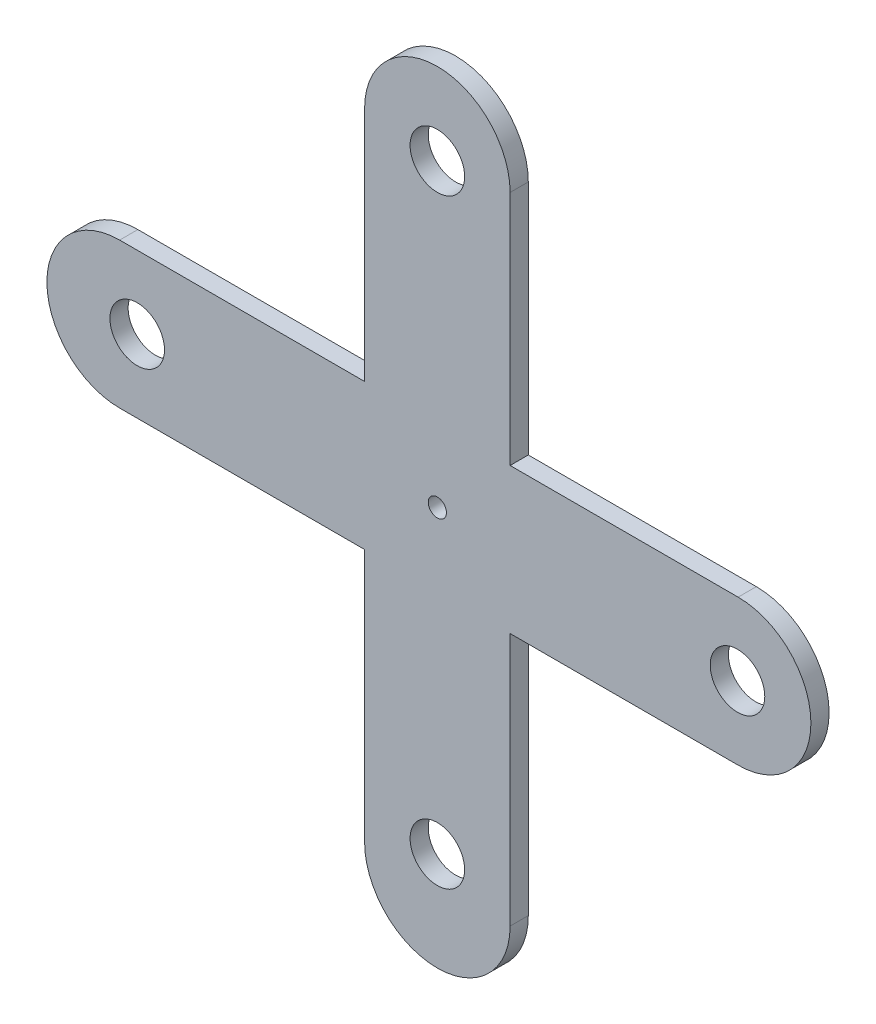
ISO-10303-21;
HEADER;
FILE_DESCRIPTION(('STEP AP214'),'2;1');
FILE_NAME('part.step','',(''),(''),'','','');
FILE_SCHEMA(('AUTOMOTIVE_DESIGN { 1 0 10303 214 1 1 1 1 }'));
ENDSEC;
DATA;
#1=APPLICATION_CONTEXT('core data for automotive mechanical design processes');
#2=APPLICATION_PROTOCOL_DEFINITION('international standard','automotive_design',2000,#1);
#3=PRODUCT_CONTEXT('',#1,'mechanical');
#4=PRODUCT('Part','Part','',(#3));
#5=PRODUCT_RELATED_PRODUCT_CATEGORY('part','',(#4));
#6=PRODUCT_DEFINITION_FORMATION('','',#4);
#7=PRODUCT_DEFINITION_CONTEXT('part definition',#1,'design');
#8=PRODUCT_DEFINITION('design','',#6,#7);
#9=PRODUCT_DEFINITION_SHAPE('','',#8);
#10=(LENGTH_UNIT() NAMED_UNIT(*) SI_UNIT(.MILLI.,.METRE.));
#11=(NAMED_UNIT(*) PLANE_ANGLE_UNIT() SI_UNIT($,.RADIAN.));
#12=(NAMED_UNIT(*) SI_UNIT($,.STERADIAN.) SOLID_ANGLE_UNIT());
#13=UNCERTAINTY_MEASURE_WITH_UNIT(LENGTH_MEASURE(1.E-05),#10,'distance_accuracy_value','');
#14=(GEOMETRIC_REPRESENTATION_CONTEXT(3) GLOBAL_UNCERTAINTY_ASSIGNED_CONTEXT((#13)) GLOBAL_UNIT_ASSIGNED_CONTEXT((#10,
#11,#12)) REPRESENTATION_CONTEXT('',''));
#15=CARTESIAN_POINT('',(0.,0.,0.));
#16=DIRECTION('',(0.,0.,1.));
#17=DIRECTION('',(1.,0.,0.));
#18=AXIS2_PLACEMENT_3D('',#15,#16,#17);
#19=CARTESIAN_POINT('',(0.,15.530340063762,1.));
#20=DIRECTION('',(0.,0.,-1.));
#21=DIRECTION('',(-1.,0.,0.));
#22=AXIS2_PLACEMENT_3D('',#19,#20,#21);
#23=CYLINDRICAL_SURFACE('',#22,4.);
#24=CARTESIAN_POINT('',(0.,15.530340063762,0.));
#25=DIRECTION('',(0.,0.,1.));
#26=DIRECTION('',(1.,0.,0.));
#27=AXIS2_PLACEMENT_3D('',#24,#25,#26);
#28=CIRCLE('',#27,4.);
#29=CARTESIAN_POINT('',(4.,15.530340063762,0.));
#30=VERTEX_POINT('',#29);
#31=CARTESIAN_POINT('',(-4.,15.530340063762,0.));
#32=VERTEX_POINT('',#31);
#33=EDGE_CURVE('E161',#30,#32,#28,.T.);
#34=ORIENTED_EDGE('',*,*,#33,.T.);
#35=DIRECTION('',(0.,0.,-1.));
#36=VECTOR('',#35,1.);
#37=CARTESIAN_POINT('',(-4.,15.530340063762,1.));
#38=LINE('',#37,#36);
#39=CARTESIAN_POINT('',(-4.,15.530340063762,1.));
#40=VERTEX_POINT('',#39);
#41=EDGE_CURVE('E11',#40,#32,#38,.T.);
#42=ORIENTED_EDGE('',*,*,#41,.F.);
#43=CARTESIAN_POINT('',(0.,15.530340063762,1.));
#44=DIRECTION('',(0.,0.,1.));
#45=DIRECTION('',(1.,0.,0.));
#46=AXIS2_PLACEMENT_3D('',#43,#44,#45);
#47=CIRCLE('',#46,4.);
#48=CARTESIAN_POINT('',(4.,15.530340063762,1.));
#49=VERTEX_POINT('',#48);
#50=EDGE_CURVE('E183',#49,#40,#47,.T.);
#51=ORIENTED_EDGE('',*,*,#50,.F.);
#52=DIRECTION('',(0.,0.,-1.));
#53=VECTOR('',#52,1.);
#54=CARTESIAN_POINT('',(4.,15.530340063762,1.));
#55=LINE('',#54,#53);
#56=EDGE_CURVE('E157',#49,#30,#55,.T.);
#57=ORIENTED_EDGE('',*,*,#56,.T.);
#58=EDGE_LOOP('',(#34,#42,#51,#57));
#59=FACE_BOUND('',#58,.T.);
#60=ADVANCED_FACE('F39',(#59),#23,.T.);
#61=CARTESIAN_POINT('',(-4.00000000000001,2.53034006376197,1.));
#62=DIRECTION('',(1.,0.,0.));
#63=DIRECTION('',(0.,1.,0.));
#64=AXIS2_PLACEMENT_3D('',#61,#62,#63);
#65=PLANE('',#64);
#66=DIRECTION('',(0.,-1.,0.));
#67=VECTOR('',#66,1.);
#68=CARTESIAN_POINT('',(-4.00000000000001,2.53034006376197,0.));
#69=LINE('',#68,#67);
#70=CARTESIAN_POINT('',(-4.00000000000001,2.53034006376197,0.));
#71=VERTEX_POINT('',#70);
#72=EDGE_CURVE('E164',#32,#71,#69,.T.);
#73=ORIENTED_EDGE('',*,*,#72,.T.);
#74=DIRECTION('',(0.,0.,-1.));
#75=VECTOR('',#74,1.);
#76=CARTESIAN_POINT('',(-4.00000000000001,2.53034006376197,1.));
#77=LINE('',#76,#75);
#78=CARTESIAN_POINT('',(-4.00000000000001,2.53034006376197,1.));
#79=VERTEX_POINT('',#78);
#80=EDGE_CURVE('E48',#79,#71,#77,.T.);
#81=ORIENTED_EDGE('',*,*,#80,.F.);
#82=DIRECTION('',(0.,-1.,0.));
#83=VECTOR('',#82,1.);
#84=CARTESIAN_POINT('',(-4.00000000000001,2.53034006376197,1.));
#85=LINE('',#84,#83);
#86=EDGE_CURVE('E112',#40,#79,#85,.T.);
#87=ORIENTED_EDGE('',*,*,#86,.F.);
#88=ORIENTED_EDGE('',*,*,#41,.T.);
#89=EDGE_LOOP('',(#73,#81,#87,#88));
#90=FACE_BOUND('',#89,.T.);
#91=ADVANCED_FACE('F239',(#90),#65,.F.);
#92=CARTESIAN_POINT('',(-17.4644660940672,2.53034006376197,1.));
#93=DIRECTION('',(0.,-1.,0.));
#94=DIRECTION('',(0.,0.,-1.));
#95=AXIS2_PLACEMENT_3D('',#92,#93,#94);
#96=PLANE('',#95);
#97=DIRECTION('',(-1.,0.,0.));
#98=VECTOR('',#97,1.);
#99=CARTESIAN_POINT('',(-17.4644660940672,2.53034006376197,0.));
#100=LINE('',#99,#98);
#101=CARTESIAN_POINT('',(-17.4644660940672,2.53034006376197,0.));
#102=VERTEX_POINT('',#101);
#103=EDGE_CURVE('E166',#71,#102,#100,.T.);
#104=ORIENTED_EDGE('',*,*,#103,.T.);
#105=DIRECTION('',(0.,0.,-1.));
#106=VECTOR('',#105,1.);
#107=CARTESIAN_POINT('',(-17.4644660940672,2.53034006376197,1.));
#108=LINE('',#107,#106);
#109=CARTESIAN_POINT('',(-17.4644660940672,2.53034006376197,1.));
#110=VERTEX_POINT('',#109);
#111=EDGE_CURVE('E202',#110,#102,#108,.T.);
#112=ORIENTED_EDGE('',*,*,#111,.F.);
#113=DIRECTION('',(-1.,0.,0.));
#114=VECTOR('',#113,1.);
#115=CARTESIAN_POINT('',(-17.4644660940672,2.53034006376197,1.));
#116=LINE('',#115,#114);
#117=EDGE_CURVE('E254',#79,#110,#116,.T.);
#118=ORIENTED_EDGE('',*,*,#117,.F.);
#119=ORIENTED_EDGE('',*,*,#80,.T.);
#120=EDGE_LOOP('',(#104,#112,#118,#119));
#121=FACE_BOUND('',#120,.T.);
#122=ADVANCED_FACE('F244',(#121),#96,.F.);
#123=CARTESIAN_POINT('',(-17.4644660940672,-1.46965993623803,1.));
#124=DIRECTION('',(0.,0.,-1.));
#125=DIRECTION('',(-1.,0.,0.));
#126=AXIS2_PLACEMENT_3D('',#123,#124,#125);
#127=CYLINDRICAL_SURFACE('',#126,4.);
#128=CARTESIAN_POINT('',(-17.4644660940672,-1.46965993623803,0.));
#129=DIRECTION('',(0.,0.,1.));
#130=DIRECTION('',(-1.,0.,0.));
#131=AXIS2_PLACEMENT_3D('',#128,#129,#130);
#132=CIRCLE('',#131,4.);
#133=CARTESIAN_POINT('',(-17.4644660940672,-5.46965993623803,0.));
#134=VERTEX_POINT('',#133);
#135=EDGE_CURVE('E168',#102,#134,#132,.T.);
#136=ORIENTED_EDGE('',*,*,#135,.T.);
#137=DIRECTION('',(0.,0.,-1.));
#138=VECTOR('',#137,1.);
#139=CARTESIAN_POINT('',(-17.4644660940672,-5.46965993623803,1.));
#140=LINE('',#139,#138);
#141=CARTESIAN_POINT('',(-17.4644660940672,-5.46965993623803,1.));
#142=VERTEX_POINT('',#141);
#143=EDGE_CURVE('E199',#142,#134,#140,.T.);
#144=ORIENTED_EDGE('',*,*,#143,.F.);
#145=CARTESIAN_POINT('',(-17.4644660940672,-1.46965993623803,1.));
#146=DIRECTION('',(0.,0.,1.));
#147=DIRECTION('',(-1.,0.,0.));
#148=AXIS2_PLACEMENT_3D('',#145,#146,#147);
#149=CIRCLE('',#148,4.);
#150=EDGE_CURVE('E256',#110,#142,#149,.T.);
#151=ORIENTED_EDGE('',*,*,#150,.F.);
#152=ORIENTED_EDGE('',*,*,#111,.T.);
#153=EDGE_LOOP('',(#136,#144,#151,#152));
#154=FACE_BOUND('',#153,.T.);
#155=ADVANCED_FACE('F294',(#154),#127,.T.);
#156=CARTESIAN_POINT('',(-3.99999999999994,-5.46965993623803,1.));
#157=DIRECTION('',(0.,1.,0.));
#158=DIRECTION('',(-1.,0.,0.));
#159=AXIS2_PLACEMENT_3D('',#156,#157,#158);
#160=PLANE('',#159);
#161=DIRECTION('',(1.,0.,0.));
#162=VECTOR('',#161,1.);
#163=CARTESIAN_POINT('',(-3.99999999999994,-5.46965993623803,0.));
#164=LINE('',#163,#162);
#165=CARTESIAN_POINT('',(-3.99999999999994,-5.46965993623803,0.));
#166=VERTEX_POINT('',#165);
#167=EDGE_CURVE('E170',#134,#166,#164,.T.);
#168=ORIENTED_EDGE('',*,*,#167,.T.);
#169=DIRECTION('',(0.,0.,-1.));
#170=VECTOR('',#169,1.);
#171=CARTESIAN_POINT('',(-3.99999999999994,-5.46965993623803,1.));
#172=LINE('',#171,#170);
#173=CARTESIAN_POINT('',(-3.99999999999994,-5.46965993623803,1.));
#174=VERTEX_POINT('',#173);
#175=EDGE_CURVE('E196',#174,#166,#172,.T.);
#176=ORIENTED_EDGE('',*,*,#175,.F.);
#177=DIRECTION('',(1.,0.,0.));
#178=VECTOR('',#177,1.);
#179=CARTESIAN_POINT('',(-3.99999999999994,-5.46965993623803,1.));
#180=LINE('',#179,#178);
#181=EDGE_CURVE('E258',#142,#174,#180,.T.);
#182=ORIENTED_EDGE('',*,*,#181,.F.);
#183=ORIENTED_EDGE('',*,*,#143,.T.);
#184=EDGE_LOOP('',(#168,#176,#182,#183));
#185=FACE_BOUND('',#184,.T.);
#186=ADVANCED_FACE('F291',(#185),#160,.F.);
#187=CARTESIAN_POINT('',(-3.99999999999994,-5.46965993623803,1.));
#188=DIRECTION('',(1.,0.,0.));
#189=DIRECTION('',(0.,1.,0.));
#190=AXIS2_PLACEMENT_3D('',#187,#188,#189);
#191=PLANE('',#190);
#192=DIRECTION('',(0.,-1.,0.));
#193=VECTOR('',#192,1.);
#194=CARTESIAN_POINT('',(-3.99999999999994,-5.46965993623803,0.));
#195=LINE('',#194,#193);
#196=CARTESIAN_POINT('',(-3.99999999999994,-19.3985921243724,0.));
#197=VERTEX_POINT('',#196);
#198=EDGE_CURVE('E172',#166,#197,#195,.T.);
#199=ORIENTED_EDGE('',*,*,#198,.T.);
#200=DIRECTION('',(0.,0.,-1.));
#201=VECTOR('',#200,1.);
#202=CARTESIAN_POINT('',(-3.99999999999994,-19.3985921243724,1.));
#203=LINE('',#202,#201);
#204=CARTESIAN_POINT('',(-3.99999999999994,-19.3985921243724,1.));
#205=VERTEX_POINT('',#204);
#206=EDGE_CURVE('E193',#205,#197,#203,.T.);
#207=ORIENTED_EDGE('',*,*,#206,.F.);
#208=DIRECTION('',(0.,-1.,0.));
#209=VECTOR('',#208,1.);
#210=CARTESIAN_POINT('',(-3.99999999999994,-5.46965993623803,1.));
#211=LINE('',#210,#209);
#212=EDGE_CURVE('E264',#174,#205,#211,.T.);
#213=ORIENTED_EDGE('',*,*,#212,.F.);
#214=ORIENTED_EDGE('',*,*,#175,.T.);
#215=EDGE_LOOP('',(#199,#207,#213,#214));
#216=FACE_BOUND('',#215,.T.);
#217=ADVANCED_FACE('F287',(#216),#191,.F.);
#218=CARTESIAN_POINT('',(0.,-19.3985921243724,1.));
#219=DIRECTION('',(0.,0.,-1.));
#220=DIRECTION('',(-1.,0.,0.));
#221=AXIS2_PLACEMENT_3D('',#218,#219,#220);
#222=CYLINDRICAL_SURFACE('',#221,4.);
#223=CARTESIAN_POINT('',(0.,-19.3985921243724,0.));
#224=DIRECTION('',(0.,0.,1.));
#225=DIRECTION('',(-1.,0.,0.));
#226=AXIS2_PLACEMENT_3D('',#223,#224,#225);
#227=CIRCLE('',#226,4.);
#228=CARTESIAN_POINT('',(4.00000000000006,-19.3985921243724,0.));
#229=VERTEX_POINT('',#228);
#230=EDGE_CURVE('E174',#197,#229,#227,.T.);
#231=ORIENTED_EDGE('',*,*,#230,.T.);
#232=DIRECTION('',(0.,0.,-1.));
#233=VECTOR('',#232,1.);
#234=CARTESIAN_POINT('',(4.00000000000006,-19.3985921243724,1.));
#235=LINE('',#234,#233);
#236=CARTESIAN_POINT('',(4.00000000000006,-19.3985921243724,1.));
#237=VERTEX_POINT('',#236);
#238=EDGE_CURVE('E190',#237,#229,#235,.T.);
#239=ORIENTED_EDGE('',*,*,#238,.F.);
#240=CARTESIAN_POINT('',(0.,-19.3985921243724,1.));
#241=DIRECTION('',(0.,0.,1.));
#242=DIRECTION('',(-1.,0.,0.));
#243=AXIS2_PLACEMENT_3D('',#240,#241,#242);
#244=CIRCLE('',#243,4.);
#245=EDGE_CURVE('E266',#205,#237,#244,.T.);
#246=ORIENTED_EDGE('',*,*,#245,.F.);
#247=ORIENTED_EDGE('',*,*,#206,.T.);
#248=EDGE_LOOP('',(#231,#239,#246,#247));
#249=FACE_BOUND('',#248,.T.);
#250=ADVANCED_FACE('F283',(#249),#222,.T.);
#251=CARTESIAN_POINT('',(4.00000000000006,-5.46965993623803,1.));
#252=DIRECTION('',(-1.,0.,0.));
#253=DIRECTION('',(0.,0.,1.));
#254=AXIS2_PLACEMENT_3D('',#251,#252,#253);
#255=PLANE('',#254);
#256=DIRECTION('',(0.,1.,0.));
#257=VECTOR('',#256,1.);
#258=CARTESIAN_POINT('',(4.00000000000006,-5.46965993623803,0.));
#259=LINE('',#258,#257);
#260=CARTESIAN_POINT('',(4.00000000000006,-5.46965993623803,0.));
#261=VERTEX_POINT('',#260);
#262=EDGE_CURVE('E176',#229,#261,#259,.T.);
#263=ORIENTED_EDGE('',*,*,#262,.T.);
#264=DIRECTION('',(0.,0.,-1.));
#265=VECTOR('',#264,1.);
#266=CARTESIAN_POINT('',(4.00000000000006,-5.46965993623803,1.));
#267=LINE('',#266,#265);
#268=CARTESIAN_POINT('',(4.00000000000006,-5.46965993623803,1.));
#269=VERTEX_POINT('',#268);
#270=EDGE_CURVE('E187',#269,#261,#267,.T.);
#271=ORIENTED_EDGE('',*,*,#270,.F.);
#272=DIRECTION('',(0.,1.,0.));
#273=VECTOR('',#272,1.);
#274=CARTESIAN_POINT('',(4.00000000000006,-5.46965993623803,1.));
#275=LINE('',#274,#273);
#276=EDGE_CURVE('E268',#237,#269,#275,.T.);
#277=ORIENTED_EDGE('',*,*,#276,.F.);
#278=ORIENTED_EDGE('',*,*,#238,.T.);
#279=EDGE_LOOP('',(#263,#271,#277,#278));
#280=FACE_BOUND('',#279,.T.);
#281=ADVANCED_FACE('F274',(#280),#255,.F.);
#282=CARTESIAN_POINT('',(4.00000000000006,-5.46965993623803,1.));
#283=DIRECTION('',(0.,1.,0.));
#284=DIRECTION('',(0.,0.,1.));
#285=AXIS2_PLACEMENT_3D('',#282,#283,#284);
#286=PLANE('',#285);
#287=DIRECTION('',(1.,0.,0.));
#288=VECTOR('',#287,1.);
#289=CARTESIAN_POINT('',(4.00000000000006,-5.46965993623803,0.));
#290=LINE('',#289,#288);
#291=CARTESIAN_POINT('',(16.5355339059329,-5.46965993623803,0.));
#292=VERTEX_POINT('',#291);
#293=EDGE_CURVE('E178',#261,#292,#290,.T.);
#294=ORIENTED_EDGE('',*,*,#293,.T.);
#295=DIRECTION('',(0.,0.,-1.));
#296=VECTOR('',#295,1.);
#297=CARTESIAN_POINT('',(16.5355339059329,-5.46965993623803,1.));
#298=LINE('',#297,#296);
#299=CARTESIAN_POINT('',(16.5355339059329,-5.46965993623803,1.));
#300=VERTEX_POINT('',#299);
#301=EDGE_CURVE('E152',#300,#292,#298,.T.);
#302=ORIENTED_EDGE('',*,*,#301,.F.);
#303=DIRECTION('',(1.,0.,0.));
#304=VECTOR('',#303,1.);
#305=CARTESIAN_POINT('',(4.00000000000006,-5.46965993623803,1.));
#306=LINE('',#305,#304);
#307=EDGE_CURVE('E143',#269,#300,#306,.T.);
#308=ORIENTED_EDGE('',*,*,#307,.F.);
#309=ORIENTED_EDGE('',*,*,#270,.T.);
#310=EDGE_LOOP('',(#294,#302,#308,#309));
#311=FACE_BOUND('',#310,.T.);
#312=ADVANCED_FACE('F278',(#311),#286,.F.);
#313=CARTESIAN_POINT('',(16.5355339059329,-1.46965993623803,1.));
#314=DIRECTION('',(0.,0.,-1.));
#315=DIRECTION('',(-1.,0.,0.));
#316=AXIS2_PLACEMENT_3D('',#313,#314,#315);
#317=CYLINDRICAL_SURFACE('',#316,4.);
#318=CARTESIAN_POINT('',(16.5355339059329,-1.46965993623803,0.));
#319=DIRECTION('',(0.,0.,1.));
#320=DIRECTION('',(-1.,0.,0.));
#321=AXIS2_PLACEMENT_3D('',#318,#319,#320);
#322=CIRCLE('',#321,4.);
#323=CARTESIAN_POINT('',(16.5355339059328,2.53034006376197,0.));
#324=VERTEX_POINT('',#323);
#325=EDGE_CURVE('E151',#292,#324,#322,.T.);
#326=ORIENTED_EDGE('',*,*,#325,.T.);
#327=DIRECTION('',(0.,0.,-1.));
#328=VECTOR('',#327,1.);
#329=CARTESIAN_POINT('',(16.5355339059328,2.53034006376197,1.));
#330=LINE('',#329,#328);
#331=CARTESIAN_POINT('',(16.5355339059328,2.53034006376197,1.));
#332=VERTEX_POINT('',#331);
#333=EDGE_CURVE('E148',#332,#324,#330,.T.);
#334=ORIENTED_EDGE('',*,*,#333,.F.);
#335=CARTESIAN_POINT('',(16.5355339059329,-1.46965993623803,1.));
#336=DIRECTION('',(0.,0.,1.));
#337=DIRECTION('',(-1.,0.,0.));
#338=AXIS2_PLACEMENT_3D('',#335,#336,#337);
#339=CIRCLE('',#338,4.);
#340=EDGE_CURVE('E137',#300,#332,#339,.T.);
#341=ORIENTED_EDGE('',*,*,#340,.F.);
#342=ORIENTED_EDGE('',*,*,#301,.T.);
#343=EDGE_LOOP('',(#326,#334,#341,#342));
#344=FACE_BOUND('',#343,.T.);
#345=ADVANCED_FACE('F149',(#344),#317,.T.);
#346=CARTESIAN_POINT('',(3.99999999999999,2.53034006376197,1.));
#347=DIRECTION('',(0.,-1.,0.));
#348=DIRECTION('',(0.,0.,-1.));
#349=AXIS2_PLACEMENT_3D('',#346,#347,#348);
#350=PLANE('',#349);
#351=DIRECTION('',(-1.,0.,0.));
#352=VECTOR('',#351,1.);
#353=CARTESIAN_POINT('',(3.99999999999999,2.53034006376197,0.));
#354=LINE('',#353,#352);
#355=CARTESIAN_POINT('',(3.99999999999999,2.53034006376197,0.));
#356=VERTEX_POINT('',#355);
#357=EDGE_CURVE('E98',#324,#356,#354,.T.);
#358=ORIENTED_EDGE('',*,*,#357,.T.);
#359=DIRECTION('',(0.,0.,-1.));
#360=VECTOR('',#359,1.);
#361=CARTESIAN_POINT('',(3.99999999999999,2.53034006376197,1.));
#362=LINE('',#361,#360);
#363=CARTESIAN_POINT('',(3.99999999999999,2.53034006376197,1.));
#364=VERTEX_POINT('',#363);
#365=EDGE_CURVE('E153',#364,#356,#362,.T.);
#366=ORIENTED_EDGE('',*,*,#365,.F.);
#367=DIRECTION('',(-1.,0.,0.));
#368=VECTOR('',#367,1.);
#369=CARTESIAN_POINT('',(3.99999999999999,2.53034006376197,1.));
#370=LINE('',#369,#368);
#371=EDGE_CURVE('E141',#332,#364,#370,.T.);
#372=ORIENTED_EDGE('',*,*,#371,.F.);
#373=ORIENTED_EDGE('',*,*,#333,.T.);
#374=EDGE_LOOP('',(#358,#366,#372,#373));
#375=FACE_BOUND('',#374,.T.);
#376=ADVANCED_FACE('F155',(#375),#350,.F.);
#377=CARTESIAN_POINT('',(3.99999999999999,2.53034006376197,1.));
#378=DIRECTION('',(-1.,0.,0.));
#379=DIRECTION('',(0.,-1.,0.));
#380=AXIS2_PLACEMENT_3D('',#377,#378,#379);
#381=PLANE('',#380);
#382=DIRECTION('',(0.,1.,0.));
#383=VECTOR('',#382,1.);
#384=CARTESIAN_POINT('',(3.99999999999999,2.53034006376197,0.));
#385=LINE('',#384,#383);
#386=EDGE_CURVE('E104',#356,#30,#385,.T.);
#387=ORIENTED_EDGE('',*,*,#386,.T.);
#388=ORIENTED_EDGE('',*,*,#56,.F.);
#389=DIRECTION('',(0.,1.,0.));
#390=VECTOR('',#389,1.);
#391=CARTESIAN_POINT('',(3.99999999999999,2.53034006376197,1.));
#392=LINE('',#391,#390);
#393=EDGE_CURVE('E57',#364,#49,#392,.T.);
#394=ORIENTED_EDGE('',*,*,#393,.F.);
#395=ORIENTED_EDGE('',*,*,#365,.T.);
#396=EDGE_LOOP('',(#387,#388,#394,#395));
#397=FACE_BOUND('',#396,.T.);
#398=ADVANCED_FACE('F316',(#397),#381,.F.);
#399=CARTESIAN_POINT('',(0.,15.530340063762,1.));
#400=DIRECTION('',(0.,0.,1.));
#401=DIRECTION('',(1.,0.,0.));
#402=AXIS2_PLACEMENT_3D('',#399,#400,#401);
#403=PLANE('',#402);
#404=CARTESIAN_POINT('',(0.,15.030340063762,1.));
#405=DIRECTION('',(0.,0.,1.));
#406=DIRECTION('',(1.,0.,0.));
#407=AXIS2_PLACEMENT_3D('',#404,#405,#406);
#408=CIRCLE('',#407,1.5);
#409=CARTESIAN_POINT('',(1.50000000000003,15.030340063762,1.));
#410=VERTEX_POINT('',#409);
#411=EDGE_CURVE('E338',#410,#410,#408,.T.);
#412=ORIENTED_EDGE('',*,*,#411,.F.);
#413=EDGE_LOOP('',(#412));
#414=FACE_BOUND('',#413,.T.);
#415=CARTESIAN_POINT('',(16.5,-1.46965993623803,1.));
#416=DIRECTION('',(0.,0.,1.));
#417=DIRECTION('',(1.,0.,0.));
#418=AXIS2_PLACEMENT_3D('',#415,#416,#417);
#419=CIRCLE('',#418,1.5);
#420=CARTESIAN_POINT('',(18.,-1.46965993623803,1.));
#421=VERTEX_POINT('',#420);
#422=EDGE_CURVE('E340',#421,#421,#419,.T.);
#423=ORIENTED_EDGE('',*,*,#422,.F.);
#424=EDGE_LOOP('',(#423));
#425=FACE_BOUND('',#424,.T.);
#426=CARTESIAN_POINT('',(0.,-17.969659936238,1.));
#427=DIRECTION('',(0.,0.,1.));
#428=DIRECTION('',(1.,0.,0.));
#429=AXIS2_PLACEMENT_3D('',#426,#427,#428);
#430=CIRCLE('',#429,1.5);
#431=CARTESIAN_POINT('',(1.50000000000003,-17.969659936238,1.));
#432=VERTEX_POINT('',#431);
#433=EDGE_CURVE('E344',#432,#432,#430,.T.);
#434=ORIENTED_EDGE('',*,*,#433,.F.);
#435=EDGE_LOOP('',(#434));
#436=FACE_BOUND('',#435,.T.);
#437=CARTESIAN_POINT('',(-16.5,-1.46965993623803,1.));
#438=DIRECTION('',(0.,0.,1.));
#439=DIRECTION('',(1.,0.,0.));
#440=AXIS2_PLACEMENT_3D('',#437,#438,#439);
#441=CIRCLE('',#440,1.5);
#442=CARTESIAN_POINT('',(-15.,-1.46965993623803,1.));
#443=VERTEX_POINT('',#442);
#444=EDGE_CURVE('E346',#443,#443,#441,.T.);
#445=ORIENTED_EDGE('',*,*,#444,.F.);
#446=EDGE_LOOP('',(#445));
#447=FACE_BOUND('',#446,.T.);
#448=CARTESIAN_POINT('',(0.,-1.46965993623803,1.));
#449=DIRECTION('',(0.,0.,1.));
#450=DIRECTION('',(1.,0.,0.));
#451=AXIS2_PLACEMENT_3D('',#448,#449,#450);
#452=CIRCLE('',#451,0.5);
#453=CARTESIAN_POINT('',(0.500000000000031,-1.46965993623803,1.));
#454=VERTEX_POINT('',#453);
#455=EDGE_CURVE('E211',#454,#454,#452,.T.);
#456=ORIENTED_EDGE('',*,*,#455,.F.);
#457=EDGE_LOOP('',(#456));
#458=FACE_BOUND('',#457,.T.);
#459=ORIENTED_EDGE('',*,*,#50,.T.);
#460=ORIENTED_EDGE('',*,*,#86,.T.);
#461=ORIENTED_EDGE('',*,*,#117,.T.);
#462=ORIENTED_EDGE('',*,*,#150,.T.);
#463=ORIENTED_EDGE('',*,*,#181,.T.);
#464=ORIENTED_EDGE('',*,*,#212,.T.);
#465=ORIENTED_EDGE('',*,*,#245,.T.);
#466=ORIENTED_EDGE('',*,*,#276,.T.);
#467=ORIENTED_EDGE('',*,*,#307,.T.);
#468=ORIENTED_EDGE('',*,*,#340,.T.);
#469=ORIENTED_EDGE('',*,*,#371,.T.);
#470=ORIENTED_EDGE('',*,*,#393,.T.);
#471=EDGE_LOOP('',(#459,#460,#461,#462,#463,#464,#465,#466,#467,#468,#469,#470));
#472=FACE_BOUND('',#471,.T.);
#473=ADVANCED_FACE('F139',(#414,#425,#436,#447,#458,#472),#403,.T.);
#474=CARTESIAN_POINT('',(0.,15.530340063762,0.));
#475=DIRECTION('',(0.,0.,1.));
#476=DIRECTION('',(1.,0.,0.));
#477=AXIS2_PLACEMENT_3D('',#474,#475,#476);
#478=PLANE('',#477);
#479=CARTESIAN_POINT('',(0.,15.030340063762,0.));
#480=DIRECTION('',(0.,0.,1.));
#481=DIRECTION('',(1.,0.,0.));
#482=AXIS2_PLACEMENT_3D('',#479,#480,#481);
#483=CIRCLE('',#482,1.5);
#484=CARTESIAN_POINT('',(1.50000000000003,15.030340063762,0.));
#485=VERTEX_POINT('',#484);
#486=EDGE_CURVE('E42',#485,#485,#483,.T.);
#487=ORIENTED_EDGE('',*,*,#486,.T.);
#488=EDGE_LOOP('',(#487));
#489=FACE_BOUND('',#488,.T.);
#490=CARTESIAN_POINT('',(16.5,-1.46965993623803,0.));
#491=DIRECTION('',(0.,0.,1.));
#492=DIRECTION('',(1.,0.,0.));
#493=AXIS2_PLACEMENT_3D('',#490,#491,#492);
#494=CIRCLE('',#493,1.5);
#495=CARTESIAN_POINT('',(18.,-1.46965993623803,0.));
#496=VERTEX_POINT('',#495);
#497=EDGE_CURVE('E216',#496,#496,#494,.T.);
#498=ORIENTED_EDGE('',*,*,#497,.T.);
#499=EDGE_LOOP('',(#498));
#500=FACE_BOUND('',#499,.T.);
#501=CARTESIAN_POINT('',(0.,-17.969659936238,0.));
#502=DIRECTION('',(0.,0.,1.));
#503=DIRECTION('',(1.,0.,0.));
#504=AXIS2_PLACEMENT_3D('',#501,#502,#503);
#505=CIRCLE('',#504,1.5);
#506=CARTESIAN_POINT('',(1.50000000000003,-17.969659936238,0.));
#507=VERTEX_POINT('',#506);
#508=EDGE_CURVE('E214',#507,#507,#505,.T.);
#509=ORIENTED_EDGE('',*,*,#508,.T.);
#510=EDGE_LOOP('',(#509));
#511=FACE_BOUND('',#510,.T.);
#512=CARTESIAN_POINT('',(-16.5,-1.46965993623803,0.));
#513=DIRECTION('',(0.,0.,1.));
#514=DIRECTION('',(1.,0.,0.));
#515=AXIS2_PLACEMENT_3D('',#512,#513,#514);
#516=CIRCLE('',#515,1.5);
#517=CARTESIAN_POINT('',(-15.,-1.46965993623803,0.));
#518=VERTEX_POINT('',#517);
#519=EDGE_CURVE('E210',#518,#518,#516,.T.);
#520=ORIENTED_EDGE('',*,*,#519,.T.);
#521=EDGE_LOOP('',(#520));
#522=FACE_BOUND('',#521,.T.);
#523=CARTESIAN_POINT('',(0.,-1.46965993623803,0.));
#524=DIRECTION('',(0.,0.,1.));
#525=DIRECTION('',(1.,0.,0.));
#526=AXIS2_PLACEMENT_3D('',#523,#524,#525);
#527=CIRCLE('',#526,0.5);
#528=CARTESIAN_POINT('',(0.500000000000031,-1.46965993623803,0.));
#529=VERTEX_POINT('',#528);
#530=EDGE_CURVE('E207',#529,#529,#527,.T.);
#531=ORIENTED_EDGE('',*,*,#530,.T.);
#532=EDGE_LOOP('',(#531));
#533=FACE_BOUND('',#532,.T.);
#534=ORIENTED_EDGE('',*,*,#33,.F.);
#535=ORIENTED_EDGE('',*,*,#386,.F.);
#536=ORIENTED_EDGE('',*,*,#357,.F.);
#537=ORIENTED_EDGE('',*,*,#325,.F.);
#538=ORIENTED_EDGE('',*,*,#293,.F.);
#539=ORIENTED_EDGE('',*,*,#262,.F.);
#540=ORIENTED_EDGE('',*,*,#230,.F.);
#541=ORIENTED_EDGE('',*,*,#198,.F.);
#542=ORIENTED_EDGE('',*,*,#167,.F.);
#543=ORIENTED_EDGE('',*,*,#135,.F.);
#544=ORIENTED_EDGE('',*,*,#103,.F.);
#545=ORIENTED_EDGE('',*,*,#72,.F.);
#546=EDGE_LOOP('',(#534,#535,#536,#537,#538,#539,#540,#541,#542,#543,#544,#545));
#547=FACE_BOUND('',#546,.T.);
#548=ADVANCED_FACE('F223',(#489,#500,#511,#522,#533,#547),#478,.F.);
#549=CARTESIAN_POINT('',(0.,-1.46965993623803,-17.));
#550=DIRECTION('',(0.,0.,1.));
#551=DIRECTION('',(1.,0.,0.));
#552=AXIS2_PLACEMENT_3D('',#549,#550,#551);
#553=CYLINDRICAL_SURFACE('',#552,0.5);
#554=ORIENTED_EDGE('',*,*,#455,.T.);
#555=EDGE_LOOP('',(#554));
#556=FACE_BOUND('',#555,.T.);
#557=ORIENTED_EDGE('',*,*,#530,.F.);
#558=EDGE_LOOP('',(#557));
#559=FACE_BOUND('',#558,.T.);
#560=ADVANCED_FACE('F321',(#556,#559),#553,.F.);
#561=CARTESIAN_POINT('',(-16.5,-1.46965993623803,-17.));
#562=DIRECTION('',(0.,0.,1.));
#563=DIRECTION('',(1.,0.,0.));
#564=AXIS2_PLACEMENT_3D('',#561,#562,#563);
#565=CYLINDRICAL_SURFACE('',#564,1.5);
#566=ORIENTED_EDGE('',*,*,#444,.T.);
#567=EDGE_LOOP('',(#566));
#568=FACE_BOUND('',#567,.T.);
#569=ORIENTED_EDGE('',*,*,#519,.F.);
#570=EDGE_LOOP('',(#569));
#571=FACE_BOUND('',#570,.T.);
#572=ADVANCED_FACE('F326',(#568,#571),#565,.F.);
#573=CARTESIAN_POINT('',(0.,-17.969659936238,-17.));
#574=DIRECTION('',(0.,0.,1.));
#575=DIRECTION('',(1.,0.,0.));
#576=AXIS2_PLACEMENT_3D('',#573,#574,#575);
#577=CYLINDRICAL_SURFACE('',#576,1.5);
#578=ORIENTED_EDGE('',*,*,#433,.T.);
#579=EDGE_LOOP('',(#578));
#580=FACE_BOUND('',#579,.T.);
#581=ORIENTED_EDGE('',*,*,#508,.F.);
#582=EDGE_LOOP('',(#581));
#583=FACE_BOUND('',#582,.T.);
#584=ADVANCED_FACE('F233',(#580,#583),#577,.F.);
#585=CARTESIAN_POINT('',(16.5,-1.46965993623803,-17.));
#586=DIRECTION('',(0.,0.,1.));
#587=DIRECTION('',(1.,0.,0.));
#588=AXIS2_PLACEMENT_3D('',#585,#586,#587);
#589=CYLINDRICAL_SURFACE('',#588,1.5);
#590=ORIENTED_EDGE('',*,*,#422,.T.);
#591=EDGE_LOOP('',(#590));
#592=FACE_BOUND('',#591,.T.);
#593=ORIENTED_EDGE('',*,*,#497,.F.);
#594=EDGE_LOOP('',(#593));
#595=FACE_BOUND('',#594,.T.);
#596=ADVANCED_FACE('F227',(#592,#595),#589,.F.);
#597=CARTESIAN_POINT('',(0.,15.030340063762,-17.));
#598=DIRECTION('',(0.,0.,1.));
#599=DIRECTION('',(1.,0.,0.));
#600=AXIS2_PLACEMENT_3D('',#597,#598,#599);
#601=CYLINDRICAL_SURFACE('',#600,1.5);
#602=ORIENTED_EDGE('',*,*,#411,.T.);
#603=EDGE_LOOP('',(#602));
#604=FACE_BOUND('',#603,.T.);
#605=ORIENTED_EDGE('',*,*,#486,.F.);
#606=EDGE_LOOP('',(#605));
#607=FACE_BOUND('',#606,.T.);
#608=ADVANCED_FACE('F225',(#604,#607),#601,.F.);
#609=CLOSED_SHELL('',(#60,#91,#122,#155,#186,#217,#250,#281,#312,#345,#376,#398,#473,#548,#560,
#572,#584,#596,#608));
#610=MANIFOLD_SOLID_BREP('B2',#609);
#611=ADVANCED_BREP_SHAPE_REPRESENTATION('',(#18,#610),#14);
#612=SHAPE_DEFINITION_REPRESENTATION(#9,#611);
ENDSEC;
END-ISO-10303-21;
